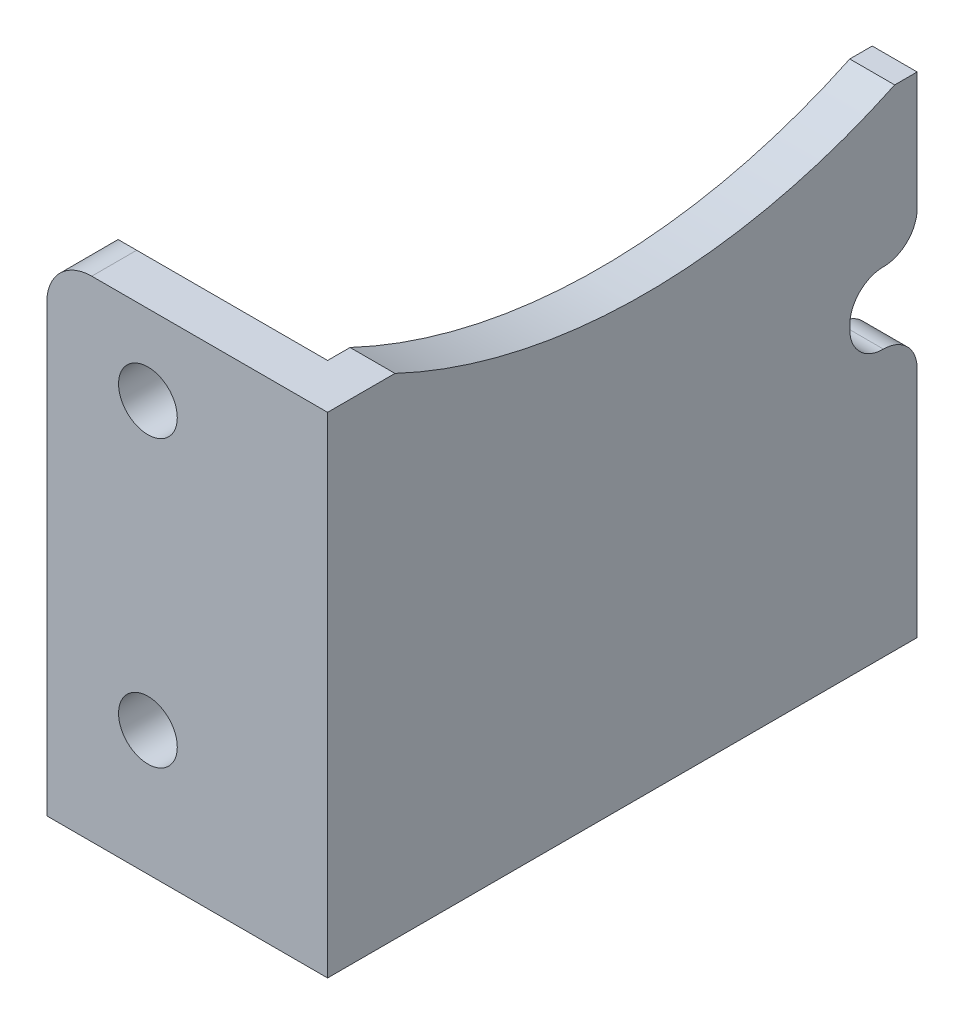
ISO-10303-21;
HEADER;
FILE_DESCRIPTION(('STEP AP214'),'2;1');
FILE_NAME('part.step','',(''),(''),'','','');
FILE_SCHEMA(('AUTOMOTIVE_DESIGN { 1 0 10303 214 1 1 1 1 }'));
ENDSEC;
DATA;
#1=APPLICATION_CONTEXT('core data for automotive mechanical design processes');
#2=APPLICATION_PROTOCOL_DEFINITION('international standard','automotive_design',2000,#1);
#3=PRODUCT_CONTEXT('',#1,'mechanical');
#4=PRODUCT('Part','Part','',(#3));
#5=PRODUCT_RELATED_PRODUCT_CATEGORY('part','',(#4));
#6=PRODUCT_DEFINITION_FORMATION('','',#4);
#7=PRODUCT_DEFINITION_CONTEXT('part definition',#1,'design');
#8=PRODUCT_DEFINITION('design','',#6,#7);
#9=PRODUCT_DEFINITION_SHAPE('','',#8);
#10=(LENGTH_UNIT() NAMED_UNIT(*) SI_UNIT(.MILLI.,.METRE.));
#11=(NAMED_UNIT(*) PLANE_ANGLE_UNIT() SI_UNIT($,.RADIAN.));
#12=(NAMED_UNIT(*) SI_UNIT($,.STERADIAN.) SOLID_ANGLE_UNIT());
#13=UNCERTAINTY_MEASURE_WITH_UNIT(LENGTH_MEASURE(1.E-05),#10,'distance_accuracy_value','');
#14=(GEOMETRIC_REPRESENTATION_CONTEXT(3) GLOBAL_UNCERTAINTY_ASSIGNED_CONTEXT((#13)) GLOBAL_UNIT_ASSIGNED_CONTEXT((#10,
#11,#12)) REPRESENTATION_CONTEXT('',''));
#15=CARTESIAN_POINT('',(0.,0.,0.));
#16=DIRECTION('',(0.,0.,1.));
#17=DIRECTION('',(1.,0.,0.));
#18=AXIS2_PLACEMENT_3D('',#15,#16,#17);
#19=CARTESIAN_POINT('',(-25.,-4.,0.));
#20=DIRECTION('',(0.,-1.,0.));
#21=DIRECTION('',(1.,0.,0.));
#22=AXIS2_PLACEMENT_3D('',#19,#20,#21);
#23=PLANE('',#22);
#24=DIRECTION('',(-1.,0.,0.));
#25=VECTOR('',#24,1.);
#26=CARTESIAN_POINT('',(0.,-4.,-50.5));
#27=LINE('',#26,#25);
#28=CARTESIAN_POINT('',(0.,-4.,-50.5));
#29=VERTEX_POINT('',#28);
#30=CARTESIAN_POINT('',(-3.99999999999999,-4.,-50.5));
#31=VERTEX_POINT('',#30);
#32=EDGE_CURVE('E174',#29,#31,#27,.T.);
#33=ORIENTED_EDGE('',*,*,#32,.F.);
#34=DIRECTION('',(0.,0.,-1.));
#35=VECTOR('',#34,1.);
#36=CARTESIAN_POINT('',(0.,-4.,0.));
#37=LINE('',#36,#35);
#38=CARTESIAN_POINT('',(0.,-4.,-52.5));
#39=VERTEX_POINT('',#38);
#40=EDGE_CURVE('E183',#29,#39,#37,.T.);
#41=ORIENTED_EDGE('',*,*,#40,.T.);
#42=DIRECTION('',(-1.,0.,0.));
#43=VECTOR('',#42,1.);
#44=CARTESIAN_POINT('',(-25.,-4.,-52.5));
#45=LINE('',#44,#43);
#46=CARTESIAN_POINT('',(-3.99999999999999,-4.,-52.5));
#47=VERTEX_POINT('',#46);
#48=EDGE_CURVE('E355',#39,#47,#45,.T.);
#49=ORIENTED_EDGE('',*,*,#48,.T.);
#50=DIRECTION('',(0.,0.,-1.));
#51=VECTOR('',#50,1.);
#52=CARTESIAN_POINT('',(-3.99999999999999,-4.,0.));
#53=LINE('',#52,#51);
#54=EDGE_CURVE('E243',#31,#47,#53,.T.);
#55=ORIENTED_EDGE('',*,*,#54,.F.);
#56=EDGE_LOOP('',(#33,#41,#49,#55));
#57=FACE_BOUND('',#56,.T.);
#58=ADVANCED_FACE('F41',(#57),#23,.F.);
#59=CARTESIAN_POINT('',(0.,0.,-6.));
#60=DIRECTION('',(1.,0.,0.));
#61=DIRECTION('',(0.,0.,-1.));
#62=AXIS2_PLACEMENT_3D('',#59,#60,#61);
#63=PLANE('',#62);
#64=DIRECTION('',(0.,1.,0.));
#65=VECTOR('',#64,1.);
#66=CARTESIAN_POINT('',(0.,-17.526,-46.5));
#67=LINE('',#66,#65);
#68=CARTESIAN_POINT('',(0.,-20.876,-46.5));
#69=VERTEX_POINT('',#68);
#70=CARTESIAN_POINT('',(0.,-20.526,-46.5));
#71=VERTEX_POINT('',#70);
#72=EDGE_CURVE('E350',#69,#71,#67,.T.);
#73=ORIENTED_EDGE('',*,*,#72,.T.);
#74=CARTESIAN_POINT('',(0.,-20.526,-49.5));
#75=DIRECTION('',(1.,0.,0.));
#76=DIRECTION('',(0.,0.,-1.));
#77=AXIS2_PLACEMENT_3D('',#74,#75,#76);
#78=CIRCLE('',#77,3.);
#79=CARTESIAN_POINT('',(0.,-17.526,-49.5));
#80=VERTEX_POINT('',#79);
#81=EDGE_CURVE('E274',#71,#80,#78,.F.);
#82=ORIENTED_EDGE('',*,*,#81,.T.);
#83=CARTESIAN_POINT('',(0.,-14.526,-49.5));
#84=DIRECTION('',(1.,0.,0.));
#85=DIRECTION('',(0.,0.,-1.));
#86=AXIS2_PLACEMENT_3D('',#83,#84,#85);
#87=CIRCLE('',#86,3.);
#88=CARTESIAN_POINT('',(0.,-14.526,-52.5));
#89=VERTEX_POINT('',#88);
#90=EDGE_CURVE('E262',#80,#89,#87,.T.);
#91=ORIENTED_EDGE('',*,*,#90,.T.);
#92=DIRECTION('',(0.,1.,0.));
#93=VECTOR('',#92,1.);
#94=CARTESIAN_POINT('',(0.,0.,-52.5));
#95=LINE('',#94,#93);
#96=EDGE_CURVE('E210',#89,#39,#95,.T.);
#97=ORIENTED_EDGE('',*,*,#96,.T.);
#98=ORIENTED_EDGE('',*,*,#40,.F.);
#99=CARTESIAN_POINT('',(0.,43.00625,-28.25));
#100=DIRECTION('',(-1.,0.,0.));
#101=DIRECTION('',(0.,0.,1.));
#102=AXIS2_PLACEMENT_3D('',#99,#100,#101);
#103=CIRCLE('',#102,52.00625);
#104=CARTESIAN_POINT('',(0.,-4.,-6.00000000000001));
#105=VERTEX_POINT('',#104);
#106=EDGE_CURVE('E169',#29,#105,#103,.T.);
#107=ORIENTED_EDGE('',*,*,#106,.T.);
#108=CARTESIAN_POINT('',(0.,-4.,0.));
#109=VERTEX_POINT('',#108);
#110=EDGE_CURVE('E185',#109,#105,#37,.T.);
#111=ORIENTED_EDGE('',*,*,#110,.F.);
#112=DIRECTION('',(0.,1.,0.));
#113=VECTOR('',#112,1.);
#114=CARTESIAN_POINT('',(0.,0.,0.));
#115=LINE('',#114,#113);
#116=CARTESIAN_POINT('',(0.,-47.625,0.));
#117=VERTEX_POINT('',#116);
#118=EDGE_CURVE('E229',#117,#109,#115,.T.);
#119=ORIENTED_EDGE('',*,*,#118,.F.);
#120=DIRECTION('',(0.,0.,1.));
#121=VECTOR('',#120,1.);
#122=CARTESIAN_POINT('',(0.,-47.625,-6.));
#123=LINE('',#122,#121);
#124=CARTESIAN_POINT('',(0.,-47.625,-52.5));
#125=VERTEX_POINT('',#124);
#126=EDGE_CURVE('E238',#125,#117,#123,.T.);
#127=ORIENTED_EDGE('',*,*,#126,.F.);
#128=CARTESIAN_POINT('',(0.,-26.876,-52.5));
#129=VERTEX_POINT('',#128);
#130=EDGE_CURVE('E212',#125,#129,#95,.T.);
#131=ORIENTED_EDGE('',*,*,#130,.T.);
#132=CARTESIAN_POINT('',(0.,-26.876,-49.5));
#133=DIRECTION('',(1.,0.,0.));
#134=DIRECTION('',(0.,0.,-1.));
#135=AXIS2_PLACEMENT_3D('',#132,#133,#134);
#136=CIRCLE('',#135,3.);
#137=CARTESIAN_POINT('',(0.,-23.876,-49.5));
#138=VERTEX_POINT('',#137);
#139=EDGE_CURVE('E265',#129,#138,#136,.T.);
#140=ORIENTED_EDGE('',*,*,#139,.T.);
#141=CARTESIAN_POINT('',(0.,-20.876,-49.5));
#142=DIRECTION('',(1.,0.,0.));
#143=DIRECTION('',(0.,0.,-1.));
#144=AXIS2_PLACEMENT_3D('',#141,#142,#143);
#145=CIRCLE('',#144,3.);
#146=EDGE_CURVE('E276',#138,#69,#145,.F.);
#147=ORIENTED_EDGE('',*,*,#146,.T.);
#148=EDGE_LOOP('',(#73,#82,#91,#97,#98,#107,#111,#119,#127,#131,#140,#147));
#149=FACE_BOUND('',#148,.T.);
#150=ADVANCED_FACE('F176',(#149),#63,.T.);
#151=CARTESIAN_POINT('',(-3.99999999999999,0.,0.));
#152=DIRECTION('',(1.,0.,0.));
#153=DIRECTION('',(0.,0.,-1.));
#154=AXIS2_PLACEMENT_3D('',#151,#152,#153);
#155=PLANE('',#154);
#156=DIRECTION('',(0.,0.,1.));
#157=VECTOR('',#156,1.);
#158=CARTESIAN_POINT('',(-3.99999999999999,-44.625,-52.5));
#159=LINE('',#158,#157);
#160=CARTESIAN_POINT('',(-3.99999999999999,-44.625,-52.5));
#161=VERTEX_POINT('',#160);
#162=CARTESIAN_POINT('',(-3.99999999999999,-44.625,-9.));
#163=VERTEX_POINT('',#162);
#164=EDGE_CURVE('E203',#161,#163,#159,.T.);
#165=ORIENTED_EDGE('',*,*,#164,.T.);
#166=DIRECTION('',(0.,-1.,0.));
#167=VECTOR('',#166,1.);
#168=CARTESIAN_POINT('',(-3.99999999999999,0.,-9.));
#169=LINE('',#168,#167);
#170=CARTESIAN_POINT('',(-3.99999999999999,-9.00000000000001,-9.));
#171=VERTEX_POINT('',#170);
#172=EDGE_CURVE('E295',#163,#171,#169,.F.);
#173=ORIENTED_EDGE('',*,*,#172,.T.);
#174=DIRECTION('',(0.,0.707106781186549,0.707106781186546));
#175=VECTOR('',#174,1.);
#176=CARTESIAN_POINT('',(-3.99999999999999,0.,0.));
#177=LINE('',#176,#175);
#178=CARTESIAN_POINT('',(-3.99999999999999,-4.,-4.00000000000001));
#179=VERTEX_POINT('',#178);
#180=EDGE_CURVE('E252',#171,#179,#177,.T.);
#181=ORIENTED_EDGE('',*,*,#180,.T.);
#182=CARTESIAN_POINT('',(-3.99999999999999,-4.,-6.00000000000001));
#183=VERTEX_POINT('',#182);
#184=EDGE_CURVE('E248',#179,#183,#53,.T.);
#185=ORIENTED_EDGE('',*,*,#184,.T.);
#186=CARTESIAN_POINT('',(-3.99999999999999,43.00625,-28.25));
#187=DIRECTION('',(-1.,0.,0.));
#188=DIRECTION('',(0.,0.,1.));
#189=AXIS2_PLACEMENT_3D('',#186,#187,#188);
#190=CIRCLE('',#189,52.00625);
#191=EDGE_CURVE('E172',#31,#183,#190,.T.);
#192=ORIENTED_EDGE('',*,*,#191,.F.);
#193=ORIENTED_EDGE('',*,*,#54,.T.);
#194=DIRECTION('',(0.,1.,0.));
#195=VECTOR('',#194,1.);
#196=CARTESIAN_POINT('',(-3.99999999999999,0.,-52.5));
#197=LINE('',#196,#195);
#198=CARTESIAN_POINT('',(-3.99999999999999,-14.526,-52.5));
#199=VERTEX_POINT('',#198);
#200=EDGE_CURVE('E213',#199,#47,#197,.T.);
#201=ORIENTED_EDGE('',*,*,#200,.F.);
#202=CARTESIAN_POINT('',(-3.99999999999999,-14.526,-49.5));
#203=DIRECTION('',(1.,0.,0.));
#204=DIRECTION('',(0.,0.,-1.));
#205=AXIS2_PLACEMENT_3D('',#202,#203,#204);
#206=CIRCLE('',#205,3.);
#207=CARTESIAN_POINT('',(-3.99999999999999,-17.526,-49.5));
#208=VERTEX_POINT('',#207);
#209=EDGE_CURVE('E257',#199,#208,#206,.F.);
#210=ORIENTED_EDGE('',*,*,#209,.T.);
#211=CARTESIAN_POINT('',(-3.99999999999999,-20.526,-49.5));
#212=DIRECTION('',(1.,0.,0.));
#213=DIRECTION('',(0.,0.,-1.));
#214=AXIS2_PLACEMENT_3D('',#211,#212,#213);
#215=CIRCLE('',#214,3.);
#216=CARTESIAN_POINT('',(-3.99999999999999,-20.526,-46.5));
#217=VERTEX_POINT('',#216);
#218=EDGE_CURVE('E272',#208,#217,#215,.T.);
#219=ORIENTED_EDGE('',*,*,#218,.T.);
#220=DIRECTION('',(0.,1.,0.));
#221=VECTOR('',#220,1.);
#222=CARTESIAN_POINT('',(-3.99999999999999,-17.526,-46.5));
#223=LINE('',#222,#221);
#224=CARTESIAN_POINT('',(-3.99999999999999,-20.876,-46.5));
#225=VERTEX_POINT('',#224);
#226=EDGE_CURVE('E341',#225,#217,#223,.T.);
#227=ORIENTED_EDGE('',*,*,#226,.F.);
#228=CARTESIAN_POINT('',(-3.99999999999999,-20.876,-49.5));
#229=DIRECTION('',(1.,0.,0.));
#230=DIRECTION('',(0.,0.,-1.));
#231=AXIS2_PLACEMENT_3D('',#228,#229,#230);
#232=CIRCLE('',#231,3.);
#233=CARTESIAN_POINT('',(-3.99999999999999,-23.876,-49.5));
#234=VERTEX_POINT('',#233);
#235=EDGE_CURVE('E280',#225,#234,#232,.T.);
#236=ORIENTED_EDGE('',*,*,#235,.T.);
#237=CARTESIAN_POINT('',(-3.99999999999999,-26.876,-49.5));
#238=DIRECTION('',(1.,0.,0.));
#239=DIRECTION('',(0.,0.,-1.));
#240=AXIS2_PLACEMENT_3D('',#237,#238,#239);
#241=CIRCLE('',#240,3.);
#242=CARTESIAN_POINT('',(-3.99999999999999,-26.876,-52.5));
#243=VERTEX_POINT('',#242);
#244=EDGE_CURVE('E256',#234,#243,#241,.F.);
#245=ORIENTED_EDGE('',*,*,#244,.T.);
#246=EDGE_CURVE('E215',#161,#243,#197,.T.);
#247=ORIENTED_EDGE('',*,*,#246,.F.);
#248=EDGE_LOOP('',(#165,#173,#181,#185,#192,#193,#201,#210,#219,#227,#236,#245,#247));
#249=FACE_BOUND('',#248,.T.);
#250=ADVANCED_FACE('F349',(#249),#155,.F.);
#251=CARTESIAN_POINT('',(-3.99999999999999,0.,-52.5));
#252=DIRECTION('',(0.,0.,-1.));
#253=DIRECTION('',(0.,1.,0.));
#254=AXIS2_PLACEMENT_3D('',#251,#252,#253);
#255=PLANE('',#254);
#256=ORIENTED_EDGE('',*,*,#96,.F.);
#257=DIRECTION('',(-1.,0.,0.));
#258=VECTOR('',#257,1.);
#259=CARTESIAN_POINT('',(-3.99999999999999,-14.526,-52.5));
#260=LINE('',#259,#258);
#261=EDGE_CURVE('E254',#89,#199,#260,.T.);
#262=ORIENTED_EDGE('',*,*,#261,.T.);
#263=ORIENTED_EDGE('',*,*,#200,.T.);
#264=ORIENTED_EDGE('',*,*,#48,.F.);
#265=EDGE_LOOP('',(#256,#262,#263,#264));
#266=FACE_BOUND('',#265,.T.);
#267=ADVANCED_FACE('F362',(#266),#255,.T.);
#268=CARTESIAN_POINT('',(-25.,0.,-6.));
#269=DIRECTION('',(-1.,0.,0.));
#270=DIRECTION('',(0.,-1.,0.));
#271=AXIS2_PLACEMENT_3D('',#268,#269,#270);
#272=PLANE('',#271);
#273=DIRECTION('',(0.,-1.,0.));
#274=VECTOR('',#273,1.);
#275=CARTESIAN_POINT('',(-25.,0.,0.));
#276=LINE('',#275,#274);
#277=CARTESIAN_POINT('',(-25.,-8.,0.));
#278=VERTEX_POINT('',#277);
#279=CARTESIAN_POINT('',(-25.,-47.625,0.));
#280=VERTEX_POINT('',#279);
#281=EDGE_CURVE('E240',#278,#280,#276,.T.);
#282=ORIENTED_EDGE('',*,*,#281,.F.);
#283=DIRECTION('',(0.,0.,-1.));
#284=VECTOR('',#283,1.);
#285=CARTESIAN_POINT('',(-25.,-8.,-4.00000000000001));
#286=LINE('',#285,#284);
#287=CARTESIAN_POINT('',(-25.,-8.,-6.));
#288=VERTEX_POINT('',#287);
#289=EDGE_CURVE('E298',#278,#288,#286,.T.);
#290=ORIENTED_EDGE('',*,*,#289,.T.);
#291=DIRECTION('',(0.,-1.,0.));
#292=VECTOR('',#291,1.);
#293=CARTESIAN_POINT('',(-25.,0.,-6.));
#294=LINE('',#293,#292);
#295=CARTESIAN_POINT('',(-25.,-44.625,-6.));
#296=VERTEX_POINT('',#295);
#297=EDGE_CURVE('E235',#288,#296,#294,.T.);
#298=ORIENTED_EDGE('',*,*,#297,.T.);
#299=DIRECTION('',(0.,-1.,0.));
#300=VECTOR('',#299,1.);
#301=CARTESIAN_POINT('',(-25.,-44.625,-6.));
#302=LINE('',#301,#300);
#303=CARTESIAN_POINT('',(-25.,-47.625,-6.));
#304=VERTEX_POINT('',#303);
#305=EDGE_CURVE('E201',#296,#304,#302,.T.);
#306=ORIENTED_EDGE('',*,*,#305,.T.);
#307=DIRECTION('',(0.,0.,1.));
#308=VECTOR('',#307,1.);
#309=CARTESIAN_POINT('',(-25.,-47.625,-6.));
#310=LINE('',#309,#308);
#311=EDGE_CURVE('E234',#304,#280,#310,.T.);
#312=ORIENTED_EDGE('',*,*,#311,.T.);
#313=EDGE_LOOP('',(#282,#290,#298,#306,#312));
#314=FACE_BOUND('',#313,.T.);
#315=ADVANCED_FACE('F318',(#314),#272,.T.);
#316=CARTESIAN_POINT('',(0.,0.,-6.));
#317=DIRECTION('',(0.,0.,-1.));
#318=DIRECTION('',(-1.,0.,0.));
#319=AXIS2_PLACEMENT_3D('',#316,#317,#318);
#320=PLANE('',#319);
#321=ORIENTED_EDGE('',*,*,#297,.F.);
#322=CARTESIAN_POINT('',(-21.,-8.,-6.));
#323=DIRECTION('',(0.,0.,-1.));
#324=DIRECTION('',(-1.,0.,0.));
#325=AXIS2_PLACEMENT_3D('',#322,#323,#324);
#326=CIRCLE('',#325,4.);
#327=CARTESIAN_POINT('',(-24.4641016151378,-5.99999999999999,-6.));
#328=VERTEX_POINT('',#327);
#329=EDGE_CURVE('E303',#288,#328,#326,.T.);
#330=ORIENTED_EDGE('',*,*,#329,.T.);
#331=DIRECTION('',(1.,0.,0.));
#332=VECTOR('',#331,1.);
#333=CARTESIAN_POINT('',(-3.99999999999999,-6.,-6.));
#334=LINE('',#333,#332);
#335=CARTESIAN_POINT('',(-6.99999999999999,-6.,-6.));
#336=VERTEX_POINT('',#335);
#337=EDGE_CURVE('E249',#328,#336,#334,.T.);
#338=ORIENTED_EDGE('',*,*,#337,.T.);
#339=DIRECTION('',(0.,-1.,0.));
#340=VECTOR('',#339,1.);
#341=CARTESIAN_POINT('',(-6.99999999999999,0.,-6.));
#342=LINE('',#341,#340);
#343=CARTESIAN_POINT('',(-6.99999999999999,-44.625,-6.));
#344=VERTEX_POINT('',#343);
#345=EDGE_CURVE('E282',#336,#344,#342,.T.);
#346=ORIENTED_EDGE('',*,*,#345,.T.);
#347=DIRECTION('',(-1.,0.,0.));
#348=VECTOR('',#347,1.);
#349=CARTESIAN_POINT('',(-3.99999999999999,-44.625,-6.));
#350=LINE('',#349,#348);
#351=EDGE_CURVE('E195',#344,#296,#350,.T.);
#352=ORIENTED_EDGE('',*,*,#351,.T.);
#353=EDGE_LOOP('',(#321,#330,#338,#346,#352));
#354=FACE_BOUND('',#353,.T.);
#355=CARTESIAN_POINT('',(-16.,-36.5125,-6.));
#356=DIRECTION('',(0.,0.,1.));
#357=DIRECTION('',(1.,0.,0.));
#358=AXIS2_PLACEMENT_3D('',#355,#356,#357);
#359=CIRCLE('',#358,2.6162);
#360=CARTESIAN_POINT('',(-13.3838,-36.5125,-6.));
#361=VERTEX_POINT('',#360);
#362=EDGE_CURVE('E219',#361,#361,#359,.T.);
#363=ORIENTED_EDGE('',*,*,#362,.T.);
#364=EDGE_LOOP('',(#363));
#365=FACE_BOUND('',#364,.T.);
#366=CARTESIAN_POINT('',(-16.,-11.1125,-6.));
#367=DIRECTION('',(0.,0.,1.));
#368=DIRECTION('',(1.,0.,0.));
#369=AXIS2_PLACEMENT_3D('',#366,#367,#368);
#370=CIRCLE('',#369,2.6162);
#371=CARTESIAN_POINT('',(-13.3838,-11.1125,-6.));
#372=VERTEX_POINT('',#371);
#373=EDGE_CURVE('E227',#372,#372,#370,.T.);
#374=ORIENTED_EDGE('',*,*,#373,.T.);
#375=EDGE_LOOP('',(#374));
#376=FACE_BOUND('',#375,.T.);
#377=ADVANCED_FACE('F304',(#354,#365,#376),#320,.T.);
#378=CARTESIAN_POINT('',(0.,-47.625,-6.));
#379=DIRECTION('',(0.,-1.,0.));
#380=DIRECTION('',(0.,0.,-1.));
#381=AXIS2_PLACEMENT_3D('',#378,#379,#380);
#382=PLANE('',#381);
#383=ORIENTED_EDGE('',*,*,#311,.F.);
#384=DIRECTION('',(0.411586722426498,0.,-0.911370599658675));
#385=VECTOR('',#384,1.);
#386=CARTESIAN_POINT('',(-25.,-47.625,-6.));
#387=LINE('',#386,#385);
#388=CARTESIAN_POINT('',(-3.99999999999999,-47.625,-52.5));
#389=VERTEX_POINT('',#388);
#390=EDGE_CURVE('E189',#304,#389,#387,.T.);
#391=ORIENTED_EDGE('',*,*,#390,.T.);
#392=DIRECTION('',(1.,0.,0.));
#393=VECTOR('',#392,1.);
#394=CARTESIAN_POINT('',(-3.99999999999999,-47.625,-52.5));
#395=LINE('',#394,#393);
#396=EDGE_CURVE('E211',#389,#125,#395,.T.);
#397=ORIENTED_EDGE('',*,*,#396,.T.);
#398=ORIENTED_EDGE('',*,*,#126,.T.);
#399=DIRECTION('',(1.,0.,0.));
#400=VECTOR('',#399,1.);
#401=CARTESIAN_POINT('',(0.,-47.625,0.));
#402=LINE('',#401,#400);
#403=EDGE_CURVE('E231',#280,#117,#402,.T.);
#404=ORIENTED_EDGE('',*,*,#403,.F.);
#405=EDGE_LOOP('',(#383,#391,#397,#398,#404));
#406=FACE_BOUND('',#405,.T.);
#407=ADVANCED_FACE('F323',(#406),#382,.T.);
#408=CARTESIAN_POINT('',(0.,0.,0.));
#409=DIRECTION('',(0.,0.,-1.));
#410=DIRECTION('',(-1.,0.,0.));
#411=AXIS2_PLACEMENT_3D('',#408,#409,#410);
#412=PLANE('',#411);
#413=DIRECTION('',(-1.,0.,0.));
#414=VECTOR('',#413,1.);
#415=CARTESIAN_POINT('',(-25.,-4.,0.));
#416=LINE('',#415,#414);
#417=CARTESIAN_POINT('',(-21.,-4.,0.));
#418=VERTEX_POINT('',#417);
#419=EDGE_CURVE('E188',#109,#418,#416,.T.);
#420=ORIENTED_EDGE('',*,*,#419,.T.);
#421=CARTESIAN_POINT('',(-21.,-8.,0.));
#422=DIRECTION('',(0.,0.,-1.));
#423=DIRECTION('',(-1.,0.,0.));
#424=AXIS2_PLACEMENT_3D('',#421,#422,#423);
#425=CIRCLE('',#424,4.);
#426=EDGE_CURVE('E11',#418,#278,#425,.F.);
#427=ORIENTED_EDGE('',*,*,#426,.T.);
#428=ORIENTED_EDGE('',*,*,#281,.T.);
#429=ORIENTED_EDGE('',*,*,#403,.T.);
#430=ORIENTED_EDGE('',*,*,#118,.T.);
#431=EDGE_LOOP('',(#420,#427,#428,#429,#430));
#432=FACE_BOUND('',#431,.T.);
#433=CARTESIAN_POINT('',(-16.,-11.1125,0.));
#434=DIRECTION('',(0.,0.,1.));
#435=DIRECTION('',(1.,0.,0.));
#436=AXIS2_PLACEMENT_3D('',#433,#434,#435);
#437=CIRCLE('',#436,2.6162);
#438=CARTESIAN_POINT('',(-13.3838,-11.1125,0.));
#439=VERTEX_POINT('',#438);
#440=EDGE_CURVE('E224',#439,#439,#437,.T.);
#441=ORIENTED_EDGE('',*,*,#440,.F.);
#442=EDGE_LOOP('',(#441));
#443=FACE_BOUND('',#442,.T.);
#444=CARTESIAN_POINT('',(-16.,-36.5125,0.));
#445=DIRECTION('',(0.,0.,1.));
#446=DIRECTION('',(1.,0.,0.));
#447=AXIS2_PLACEMENT_3D('',#444,#445,#446);
#448=CIRCLE('',#447,2.6162);
#449=CARTESIAN_POINT('',(-13.3838,-36.5125,0.));
#450=VERTEX_POINT('',#449);
#451=EDGE_CURVE('E218',#450,#450,#448,.T.);
#452=ORIENTED_EDGE('',*,*,#451,.F.);
#453=EDGE_LOOP('',(#452));
#454=FACE_BOUND('',#453,.T.);
#455=ADVANCED_FACE('F312',(#432,#443,#454),#412,.F.);
#456=CARTESIAN_POINT('',(-16.,-11.1125,-6.));
#457=DIRECTION('',(0.,0.,1.));
#458=DIRECTION('',(1.,0.,0.));
#459=AXIS2_PLACEMENT_3D('',#456,#457,#458);
#460=CYLINDRICAL_SURFACE('',#459,2.6162);
#461=ORIENTED_EDGE('',*,*,#373,.F.);
#462=EDGE_LOOP('',(#461));
#463=FACE_BOUND('',#462,.T.);
#464=ORIENTED_EDGE('',*,*,#440,.T.);
#465=EDGE_LOOP('',(#464));
#466=FACE_BOUND('',#465,.T.);
#467=ADVANCED_FACE('F540',(#463,#466),#460,.F.);
#468=CARTESIAN_POINT('',(-16.,-36.5125,-6.));
#469=DIRECTION('',(0.,0.,1.));
#470=DIRECTION('',(1.,0.,0.));
#471=AXIS2_PLACEMENT_3D('',#468,#469,#470);
#472=CYLINDRICAL_SURFACE('',#471,2.6162);
#473=ORIENTED_EDGE('',*,*,#362,.F.);
#474=EDGE_LOOP('',(#473));
#475=FACE_BOUND('',#474,.T.);
#476=ORIENTED_EDGE('',*,*,#451,.T.);
#477=EDGE_LOOP('',(#476));
#478=FACE_BOUND('',#477,.T.);
#479=ADVANCED_FACE('F384',(#475,#478),#472,.F.);
#480=ORIENTED_EDGE('',*,*,#246,.T.);
#481=DIRECTION('',(-1.,0.,0.));
#482=VECTOR('',#481,1.);
#483=CARTESIAN_POINT('',(0.,-26.876,-52.5));
#484=LINE('',#483,#482);
#485=EDGE_CURVE('E269',#243,#129,#484,.F.);
#486=ORIENTED_EDGE('',*,*,#485,.T.);
#487=ORIENTED_EDGE('',*,*,#130,.F.);
#488=ORIENTED_EDGE('',*,*,#396,.F.);
#489=EDGE_CURVE('E208',#389,#161,#197,.T.);
#490=ORIENTED_EDGE('',*,*,#489,.T.);
#491=EDGE_LOOP('',(#480,#486,#487,#488,#490));
#492=FACE_BOUND('',#491,.T.);
#493=ADVANCED_FACE('F327',(#492),#255,.T.);
#494=CARTESIAN_POINT('',(-25.,-44.625,-6.));
#495=DIRECTION('',(-0.911370599658675,0.,-0.411586722426498));
#496=DIRECTION('',(-0.411586722426498,0.,0.911370599658675));
#497=AXIS2_PLACEMENT_3D('',#494,#495,#496);
#498=PLANE('',#497);
#499=ORIENTED_EDGE('',*,*,#390,.F.);
#500=ORIENTED_EDGE('',*,*,#305,.F.);
#501=DIRECTION('',(0.411586722426498,0.,-0.911370599658675));
#502=VECTOR('',#501,1.);
#503=CARTESIAN_POINT('',(-25.,-44.625,-6.));
#504=LINE('',#503,#502);
#505=EDGE_CURVE('E200',#296,#161,#504,.T.);
#506=ORIENTED_EDGE('',*,*,#505,.T.);
#507=ORIENTED_EDGE('',*,*,#489,.F.);
#508=EDGE_LOOP('',(#499,#500,#506,#507));
#509=FACE_BOUND('',#508,.T.);
#510=ADVANCED_FACE('F374',(#509),#498,.T.);
#511=CARTESIAN_POINT('',(0.,-44.625,0.));
#512=DIRECTION('',(0.,1.,0.));
#513=DIRECTION('',(0.,0.,1.));
#514=AXIS2_PLACEMENT_3D('',#511,#512,#513);
#515=PLANE('',#514);
#516=ORIENTED_EDGE('',*,*,#351,.F.);
#517=CARTESIAN_POINT('',(-6.99999999999999,-44.625,-9.));
#518=DIRECTION('',(0.,1.,0.));
#519=DIRECTION('',(0.,0.,1.));
#520=AXIS2_PLACEMENT_3D('',#517,#518,#519);
#521=CIRCLE('',#520,3.);
#522=EDGE_CURVE('E286',#344,#163,#521,.T.);
#523=ORIENTED_EDGE('',*,*,#522,.T.);
#524=ORIENTED_EDGE('',*,*,#164,.F.);
#525=ORIENTED_EDGE('',*,*,#505,.F.);
#526=EDGE_LOOP('',(#516,#523,#524,#525));
#527=FACE_BOUND('',#526,.T.);
#528=ADVANCED_FACE('F373',(#527),#515,.T.);
#529=DIRECTION('',(-1.,0.,0.));
#530=VECTOR('',#529,1.);
#531=CARTESIAN_POINT('',(-25.,-4.,-4.00000000000001));
#532=LINE('',#531,#530);
#533=CARTESIAN_POINT('',(-21.,-4.,-4.00000000000001));
#534=VERTEX_POINT('',#533);
#535=EDGE_CURVE('E246',#179,#534,#532,.T.);
#536=ORIENTED_EDGE('',*,*,#535,.T.);
#537=DIRECTION('',(0.,0.,-1.));
#538=VECTOR('',#537,1.);
#539=CARTESIAN_POINT('',(-21.,-4.,0.));
#540=LINE('',#539,#538);
#541=EDGE_CURVE('E47',#534,#418,#540,.F.);
#542=ORIENTED_EDGE('',*,*,#541,.T.);
#543=ORIENTED_EDGE('',*,*,#419,.F.);
#544=ORIENTED_EDGE('',*,*,#110,.T.);
#545=DIRECTION('',(-1.,0.,0.));
#546=VECTOR('',#545,1.);
#547=CARTESIAN_POINT('',(0.,-4.,-6.00000000000001));
#548=LINE('',#547,#546);
#549=EDGE_CURVE('E164',#105,#183,#548,.T.);
#550=ORIENTED_EDGE('',*,*,#549,.T.);
#551=ORIENTED_EDGE('',*,*,#184,.F.);
#552=EDGE_LOOP('',(#536,#542,#543,#544,#550,#551));
#553=FACE_BOUND('',#552,.T.);
#554=ADVANCED_FACE('F190',(#553),#23,.F.);
#555=CARTESIAN_POINT('',(-25.,-4.,-4.00000000000001));
#556=DIRECTION('',(0.,0.707106781186546,-0.707106781186549));
#557=DIRECTION('',(1.,0.,0.));
#558=AXIS2_PLACEMENT_3D('',#555,#556,#557);
#559=PLANE('',#558);
#560=ORIENTED_EDGE('',*,*,#337,.F.);
#561=CARTESIAN_POINT('',(-21.,-8.,-8.));
#562=DIRECTION('',(0.,0.707106781186546,-0.707106781186549));
#563=DIRECTION('',(0.,0.707106781186549,0.707106781186546));
#564=AXIS2_PLACEMENT_3D('',#561,#562,#563);
#565=ELLIPSE('',#564,5.65685424949237,4.);
#566=EDGE_CURVE('E63',#328,#534,#565,.T.);
#567=ORIENTED_EDGE('',*,*,#566,.T.);
#568=ORIENTED_EDGE('',*,*,#535,.F.);
#569=ORIENTED_EDGE('',*,*,#180,.F.);
#570=CARTESIAN_POINT('',(-6.99999999999999,-9.00000000000001,-9.));
#571=DIRECTION('',(0.,0.707106781186546,-0.707106781186549));
#572=DIRECTION('',(0.,-0.707106781186549,-0.707106781186546));
#573=AXIS2_PLACEMENT_3D('',#570,#571,#572);
#574=ELLIPSE('',#573,4.24264068711929,3.);
#575=EDGE_CURVE('E293',#171,#336,#574,.F.);
#576=ORIENTED_EDGE('',*,*,#575,.T.);
#577=EDGE_LOOP('',(#560,#567,#568,#569,#576));
#578=FACE_BOUND('',#577,.T.);
#579=ADVANCED_FACE('F310',(#578),#559,.T.);
#580=CARTESIAN_POINT('',(0.,-17.526,-46.5));
#581=DIRECTION('',(0.,0.,1.));
#582=DIRECTION('',(1.,0.,0.));
#583=AXIS2_PLACEMENT_3D('',#580,#581,#582);
#584=PLANE('',#583);
#585=ORIENTED_EDGE('',*,*,#226,.T.);
#586=DIRECTION('',(-1.,0.,0.));
#587=VECTOR('',#586,1.);
#588=CARTESIAN_POINT('',(0.,-20.526,-46.5));
#589=LINE('',#588,#587);
#590=EDGE_CURVE('E268',#217,#71,#589,.F.);
#591=ORIENTED_EDGE('',*,*,#590,.T.);
#592=ORIENTED_EDGE('',*,*,#72,.F.);
#593=DIRECTION('',(-1.,0.,0.));
#594=VECTOR('',#593,1.);
#595=CARTESIAN_POINT('',(-3.99999999999999,-20.876,-46.5));
#596=LINE('',#595,#594);
#597=EDGE_CURVE('E266',#69,#225,#596,.T.);
#598=ORIENTED_EDGE('',*,*,#597,.T.);
#599=EDGE_LOOP('',(#585,#591,#592,#598));
#600=FACE_BOUND('',#599,.T.);
#601=ADVANCED_FACE('F344',(#600),#584,.F.);
#602=CARTESIAN_POINT('',(0.,43.00625,-28.25));
#603=DIRECTION('',(-1.,0.,0.));
#604=DIRECTION('',(0.,0.,1.));
#605=AXIS2_PLACEMENT_3D('',#602,#603,#604);
#606=CYLINDRICAL_SURFACE('',#605,52.00625);
#607=ORIENTED_EDGE('',*,*,#191,.T.);
#608=ORIENTED_EDGE('',*,*,#549,.F.);
#609=ORIENTED_EDGE('',*,*,#106,.F.);
#610=ORIENTED_EDGE('',*,*,#32,.T.);
#611=EDGE_LOOP('',(#607,#608,#609,#610));
#612=FACE_BOUND('',#611,.T.);
#613=ADVANCED_FACE('F170',(#612),#606,.F.);
#614=CARTESIAN_POINT('',(0.,-20.526,-49.5));
#615=DIRECTION('',(1.,0.,0.));
#616=DIRECTION('',(0.,0.,-1.));
#617=AXIS2_PLACEMENT_3D('',#614,#615,#616);
#618=CYLINDRICAL_SURFACE('',#617,3.);
#619=DIRECTION('',(-1.,0.,0.));
#620=VECTOR('',#619,1.);
#621=CARTESIAN_POINT('',(-3.99999999999999,-17.526,-49.5));
#622=LINE('',#621,#620);
#623=EDGE_CURVE('E285',#80,#208,#622,.T.);
#624=ORIENTED_EDGE('',*,*,#623,.F.);
#625=ORIENTED_EDGE('',*,*,#81,.F.);
#626=ORIENTED_EDGE('',*,*,#590,.F.);
#627=ORIENTED_EDGE('',*,*,#218,.F.);
#628=EDGE_LOOP('',(#624,#625,#626,#627));
#629=FACE_BOUND('',#628,.T.);
#630=ADVANCED_FACE('F411',(#629),#618,.F.);
#631=CARTESIAN_POINT('',(-3.99999999999999,-14.526,-49.5));
#632=DIRECTION('',(1.,0.,0.));
#633=DIRECTION('',(0.,0.,-1.));
#634=AXIS2_PLACEMENT_3D('',#631,#632,#633);
#635=CYLINDRICAL_SURFACE('',#634,3.);
#636=ORIENTED_EDGE('',*,*,#90,.F.);
#637=ORIENTED_EDGE('',*,*,#623,.T.);
#638=ORIENTED_EDGE('',*,*,#209,.F.);
#639=ORIENTED_EDGE('',*,*,#261,.F.);
#640=EDGE_LOOP('',(#636,#637,#638,#639));
#641=FACE_BOUND('',#640,.T.);
#642=ADVANCED_FACE('F406',(#641),#635,.T.);
#643=CARTESIAN_POINT('',(0.,-20.876,-49.5));
#644=DIRECTION('',(1.,0.,0.));
#645=DIRECTION('',(0.,0.,-1.));
#646=AXIS2_PLACEMENT_3D('',#643,#644,#645);
#647=CYLINDRICAL_SURFACE('',#646,3.);
#648=ORIENTED_EDGE('',*,*,#597,.F.);
#649=ORIENTED_EDGE('',*,*,#146,.F.);
#650=DIRECTION('',(-1.,0.,0.));
#651=VECTOR('',#650,1.);
#652=CARTESIAN_POINT('',(0.,-23.876,-49.5));
#653=LINE('',#652,#651);
#654=EDGE_CURVE('E281',#234,#138,#653,.F.);
#655=ORIENTED_EDGE('',*,*,#654,.F.);
#656=ORIENTED_EDGE('',*,*,#235,.F.);
#657=EDGE_LOOP('',(#648,#649,#655,#656));
#658=FACE_BOUND('',#657,.T.);
#659=ADVANCED_FACE('F339',(#658),#647,.F.);
#660=CARTESIAN_POINT('',(0.,-26.876,-49.5));
#661=DIRECTION('',(1.,0.,0.));
#662=DIRECTION('',(0.,0.,-1.));
#663=AXIS2_PLACEMENT_3D('',#660,#661,#662);
#664=CYLINDRICAL_SURFACE('',#663,3.);
#665=ORIENTED_EDGE('',*,*,#139,.F.);
#666=ORIENTED_EDGE('',*,*,#485,.F.);
#667=ORIENTED_EDGE('',*,*,#244,.F.);
#668=ORIENTED_EDGE('',*,*,#654,.T.);
#669=EDGE_LOOP('',(#665,#666,#667,#668));
#670=FACE_BOUND('',#669,.T.);
#671=ADVANCED_FACE('F334',(#670),#664,.T.);
#672=CARTESIAN_POINT('',(-6.99999999999999,0.,-9.));
#673=DIRECTION('',(0.,-1.,0.));
#674=DIRECTION('',(0.,0.,-1.));
#675=AXIS2_PLACEMENT_3D('',#672,#673,#674);
#676=CYLINDRICAL_SURFACE('',#675,3.);
#677=ORIENTED_EDGE('',*,*,#575,.F.);
#678=ORIENTED_EDGE('',*,*,#172,.F.);
#679=ORIENTED_EDGE('',*,*,#522,.F.);
#680=ORIENTED_EDGE('',*,*,#345,.F.);
#681=EDGE_LOOP('',(#677,#678,#679,#680));
#682=FACE_BOUND('',#681,.T.);
#683=ADVANCED_FACE('F369',(#682),#676,.F.);
#684=CARTESIAN_POINT('',(-21.,-8.,-6.));
#685=DIRECTION('',(0.,0.,1.));
#686=DIRECTION('',(1.,0.,0.));
#687=AXIS2_PLACEMENT_3D('',#684,#685,#686);
#688=CYLINDRICAL_SURFACE('',#687,4.);
#689=ORIENTED_EDGE('',*,*,#426,.F.);
#690=ORIENTED_EDGE('',*,*,#541,.F.);
#691=ORIENTED_EDGE('',*,*,#566,.F.);
#692=ORIENTED_EDGE('',*,*,#329,.F.);
#693=ORIENTED_EDGE('',*,*,#289,.F.);
#694=EDGE_LOOP('',(#689,#690,#691,#692,#693));
#695=FACE_BOUND('',#694,.T.);
#696=ADVANCED_FACE('F43',(#695),#688,.T.);
#697=CLOSED_SHELL('',(#58,#150,#250,#267,#315,#377,#407,#455,#467,#479,#493,#510,#528,#554,#579,
#601,#613,#630,#642,#659,#671,#683,#696));
#698=MANIFOLD_SOLID_BREP('B2',#697);
#699=ADVANCED_BREP_SHAPE_REPRESENTATION('',(#18,#698),#14);
#700=SHAPE_DEFINITION_REPRESENTATION(#9,#699);
ENDSEC;
END-ISO-10303-21;
